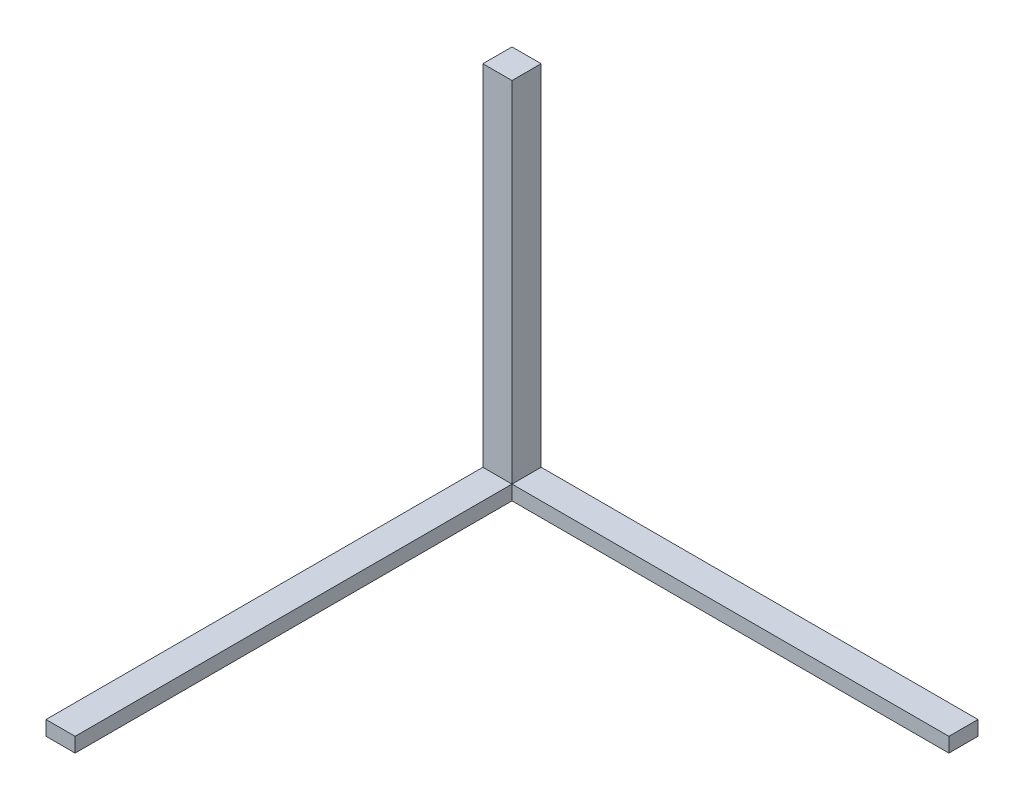
ISO-10303-21;
HEADER;
FILE_DESCRIPTION(('STEP AP214'),'2;1');
FILE_NAME('part.step','',(''),(''),'','','');
FILE_SCHEMA(('AUTOMOTIVE_DESIGN { 1 0 10303 214 1 1 1 1 }'));
ENDSEC;
DATA;
#1=APPLICATION_CONTEXT('core data for automotive mechanical design processes');
#2=APPLICATION_PROTOCOL_DEFINITION('international standard','automotive_design',2000,#1);
#3=PRODUCT_CONTEXT('',#1,'mechanical');
#4=PRODUCT('Part','Part','',(#3));
#5=PRODUCT_RELATED_PRODUCT_CATEGORY('part','',(#4));
#6=PRODUCT_DEFINITION_FORMATION('','',#4);
#7=PRODUCT_DEFINITION_CONTEXT('part definition',#1,'design');
#8=PRODUCT_DEFINITION('design','',#6,#7);
#9=PRODUCT_DEFINITION_SHAPE('','',#8);
#10=(LENGTH_UNIT() NAMED_UNIT(*) SI_UNIT(.MILLI.,.METRE.));
#11=(NAMED_UNIT(*) PLANE_ANGLE_UNIT() SI_UNIT($,.RADIAN.));
#12=(NAMED_UNIT(*) SI_UNIT($,.STERADIAN.) SOLID_ANGLE_UNIT());
#13=UNCERTAINTY_MEASURE_WITH_UNIT(LENGTH_MEASURE(1.E-05),#10,'distance_accuracy_value','');
#14=(GEOMETRIC_REPRESENTATION_CONTEXT(3) GLOBAL_UNCERTAINTY_ASSIGNED_CONTEXT((#13)) GLOBAL_UNIT_ASSIGNED_CONTEXT((#10,
#11,#12)) REPRESENTATION_CONTEXT('',''));
#15=CARTESIAN_POINT('',(0.,0.,0.));
#16=DIRECTION('',(0.,0.,1.));
#17=DIRECTION('',(1.,0.,0.));
#18=AXIS2_PLACEMENT_3D('',#15,#16,#17);
#19=CARTESIAN_POINT('',(10.,250.,10.));
#20=DIRECTION('',(-1.,0.,0.));
#21=DIRECTION('',(0.,0.,1.));
#22=AXIS2_PLACEMENT_3D('',#19,#20,#21);
#23=PLANE('',#22);
#24=DIRECTION('',(0.,-1.,0.));
#25=VECTOR('',#24,1.);
#26=CARTESIAN_POINT('',(10.,10.,10.));
#27=LINE('',#26,#25);
#28=CARTESIAN_POINT('',(10.,10.,10.));
#29=VERTEX_POINT('',#28);
#30=CARTESIAN_POINT('',(10.,0.,10.));
#31=VERTEX_POINT('',#30);
#32=EDGE_CURVE('E190',#29,#31,#27,.T.);
#33=ORIENTED_EDGE('',*,*,#32,.F.);
#34=DIRECTION('',(0.,0.,1.));
#35=VECTOR('',#34,1.);
#36=CARTESIAN_POINT('',(10.,10.,0.));
#37=LINE('',#36,#35);
#38=CARTESIAN_POINT('',(10.,10.,310.));
#39=VERTEX_POINT('',#38);
#40=EDGE_CURVE('E161',#29,#39,#37,.T.);
#41=ORIENTED_EDGE('',*,*,#40,.T.);
#42=DIRECTION('',(0.,-1.,0.));
#43=VECTOR('',#42,1.);
#44=CARTESIAN_POINT('',(10.,10.,310.));
#45=LINE('',#44,#43);
#46=CARTESIAN_POINT('',(10.,0.,310.));
#47=VERTEX_POINT('',#46);
#48=EDGE_CURVE('E153',#39,#47,#45,.T.);
#49=ORIENTED_EDGE('',*,*,#48,.T.);
#50=DIRECTION('',(0.,0.,-1.));
#51=VECTOR('',#50,1.);
#52=CARTESIAN_POINT('',(10.,0.,10.));
#53=LINE('',#52,#51);
#54=EDGE_CURVE('E133',#47,#31,#53,.T.);
#55=ORIENTED_EDGE('',*,*,#54,.T.);
#56=EDGE_LOOP('',(#33,#41,#49,#55));
#57=FACE_BOUND('',#56,.T.);
#58=ADVANCED_FACE('F39',(#57),#23,.F.);
#59=CARTESIAN_POINT('',(-10.,250.,10.));
#60=DIRECTION('',(1.,0.,0.));
#61=DIRECTION('',(0.,0.,-1.));
#62=AXIS2_PLACEMENT_3D('',#59,#60,#61);
#63=PLANE('',#62);
#64=DIRECTION('',(0.,0.,1.));
#65=VECTOR('',#64,1.);
#66=CARTESIAN_POINT('',(-10.,0.,10.));
#67=LINE('',#66,#65);
#68=CARTESIAN_POINT('',(-10.,0.,-10.));
#69=VERTEX_POINT('',#68);
#70=CARTESIAN_POINT('',(-9.99999999999996,0.,310.));
#71=VERTEX_POINT('',#70);
#72=EDGE_CURVE('E130',#69,#71,#67,.T.);
#73=ORIENTED_EDGE('',*,*,#72,.T.);
#74=DIRECTION('',(0.,-1.,0.));
#75=VECTOR('',#74,1.);
#76=CARTESIAN_POINT('',(-9.99999999999996,10.,310.));
#77=LINE('',#76,#75);
#78=CARTESIAN_POINT('',(-9.99999999999996,10.,310.));
#79=VERTEX_POINT('',#78);
#80=EDGE_CURVE('E134',#79,#71,#77,.T.);
#81=ORIENTED_EDGE('',*,*,#80,.F.);
#82=DIRECTION('',(0.,0.,1.));
#83=VECTOR('',#82,1.);
#84=CARTESIAN_POINT('',(-10.,10.,0.));
#85=LINE('',#84,#83);
#86=CARTESIAN_POINT('',(-10.,10.,10.));
#87=VERTEX_POINT('',#86);
#88=EDGE_CURVE('E165',#87,#79,#85,.T.);
#89=ORIENTED_EDGE('',*,*,#88,.F.);
#90=DIRECTION('',(0.,-1.,0.));
#91=VECTOR('',#90,1.);
#92=CARTESIAN_POINT('',(-10.,250.,10.));
#93=LINE('',#92,#91);
#94=CARTESIAN_POINT('',(-10.,250.,10.));
#95=VERTEX_POINT('',#94);
#96=EDGE_CURVE('E11',#95,#87,#93,.T.);
#97=ORIENTED_EDGE('',*,*,#96,.F.);
#98=DIRECTION('',(0.,0.,1.));
#99=VECTOR('',#98,1.);
#100=CARTESIAN_POINT('',(-10.,250.,10.));
#101=LINE('',#100,#99);
#102=CARTESIAN_POINT('',(-10.,250.,-10.));
#103=VERTEX_POINT('',#102);
#104=EDGE_CURVE('E107',#103,#95,#101,.T.);
#105=ORIENTED_EDGE('',*,*,#104,.F.);
#106=DIRECTION('',(0.,-1.,0.));
#107=VECTOR('',#106,1.);
#108=CARTESIAN_POINT('',(-10.,250.,-10.));
#109=LINE('',#108,#107);
#110=EDGE_CURVE('E126',#103,#69,#109,.T.);
#111=ORIENTED_EDGE('',*,*,#110,.T.);
#112=EDGE_LOOP('',(#73,#81,#89,#97,#105,#111));
#113=FACE_BOUND('',#112,.T.);
#114=ADVANCED_FACE('F41',(#113),#63,.F.);
#115=CARTESIAN_POINT('',(10.,250.,10.));
#116=DIRECTION('',(0.,0.,-1.));
#117=DIRECTION('',(-1.,0.,0.));
#118=AXIS2_PLACEMENT_3D('',#115,#116,#117);
#119=PLANE('',#118);
#120=ORIENTED_EDGE('',*,*,#96,.T.);
#121=DIRECTION('',(1.,0.,0.));
#122=VECTOR('',#121,1.);
#123=CARTESIAN_POINT('',(0.,10.,10.));
#124=LINE('',#123,#122);
#125=EDGE_CURVE('E117',#87,#29,#124,.T.);
#126=ORIENTED_EDGE('',*,*,#125,.T.);
#127=DIRECTION('',(0.,-1.,0.));
#128=VECTOR('',#127,1.);
#129=CARTESIAN_POINT('',(10.,250.,10.));
#130=LINE('',#129,#128);
#131=CARTESIAN_POINT('',(10.,250.,10.));
#132=VERTEX_POINT('',#131);
#133=EDGE_CURVE('E48',#132,#29,#130,.T.);
#134=ORIENTED_EDGE('',*,*,#133,.F.);
#135=DIRECTION('',(1.,0.,0.));
#136=VECTOR('',#135,1.);
#137=CARTESIAN_POINT('',(10.,250.,10.));
#138=LINE('',#137,#136);
#139=EDGE_CURVE('E100',#95,#132,#138,.T.);
#140=ORIENTED_EDGE('',*,*,#139,.F.);
#141=EDGE_LOOP('',(#120,#126,#134,#140));
#142=FACE_BOUND('',#141,.T.);
#143=ADVANCED_FACE('F114',(#142),#119,.F.);
#144=ORIENTED_EDGE('',*,*,#133,.T.);
#145=DIRECTION('',(0.,0.,-1.));
#146=VECTOR('',#145,1.);
#147=CARTESIAN_POINT('',(10.,10.,0.));
#148=LINE('',#147,#146);
#149=CARTESIAN_POINT('',(10.,10.,-10.));
#150=VERTEX_POINT('',#149);
#151=EDGE_CURVE('E177',#29,#150,#148,.T.);
#152=ORIENTED_EDGE('',*,*,#151,.T.);
#153=DIRECTION('',(0.,-1.,0.));
#154=VECTOR('',#153,1.);
#155=CARTESIAN_POINT('',(10.,250.,-10.));
#156=LINE('',#155,#154);
#157=CARTESIAN_POINT('',(10.,250.,-10.));
#158=VERTEX_POINT('',#157);
#159=EDGE_CURVE('E120',#158,#150,#156,.T.);
#160=ORIENTED_EDGE('',*,*,#159,.F.);
#161=DIRECTION('',(0.,0.,-1.));
#162=VECTOR('',#161,1.);
#163=CARTESIAN_POINT('',(10.,250.,10.));
#164=LINE('',#163,#162);
#165=EDGE_CURVE('E104',#132,#158,#164,.T.);
#166=ORIENTED_EDGE('',*,*,#165,.F.);
#167=EDGE_LOOP('',(#144,#152,#160,#166));
#168=FACE_BOUND('',#167,.T.);
#169=ADVANCED_FACE('F121',(#168),#23,.F.);
#170=CARTESIAN_POINT('',(10.,250.,-10.));
#171=DIRECTION('',(0.,0.,1.));
#172=DIRECTION('',(1.,0.,0.));
#173=AXIS2_PLACEMENT_3D('',#170,#171,#172);
#174=PLANE('',#173);
#175=DIRECTION('',(-1.,0.,0.));
#176=VECTOR('',#175,1.);
#177=CARTESIAN_POINT('',(10.,0.,-10.));
#178=LINE('',#177,#176);
#179=CARTESIAN_POINT('',(310.,0.,-10.0000000000011));
#180=VERTEX_POINT('',#179);
#181=EDGE_CURVE('E76',#180,#69,#178,.T.);
#182=ORIENTED_EDGE('',*,*,#181,.T.);
#183=ORIENTED_EDGE('',*,*,#110,.F.);
#184=DIRECTION('',(-1.,0.,0.));
#185=VECTOR('',#184,1.);
#186=CARTESIAN_POINT('',(10.,250.,-10.));
#187=LINE('',#186,#185);
#188=EDGE_CURVE('E64',#158,#103,#187,.T.);
#189=ORIENTED_EDGE('',*,*,#188,.F.);
#190=ORIENTED_EDGE('',*,*,#159,.T.);
#191=DIRECTION('',(1.,0.,0.));
#192=VECTOR('',#191,1.);
#193=CARTESIAN_POINT('',(0.,10.,-10.));
#194=LINE('',#193,#192);
#195=CARTESIAN_POINT('',(310.,10.,-10.0000000000011));
#196=VERTEX_POINT('',#195);
#197=EDGE_CURVE('E55',#150,#196,#194,.T.);
#198=ORIENTED_EDGE('',*,*,#197,.T.);
#199=DIRECTION('',(0.,-1.,0.));
#200=VECTOR('',#199,1.);
#201=CARTESIAN_POINT('',(310.,10.,-10.0000000000011));
#202=LINE('',#201,#200);
#203=EDGE_CURVE('E182',#196,#180,#202,.T.);
#204=ORIENTED_EDGE('',*,*,#203,.T.);
#205=EDGE_LOOP('',(#182,#183,#189,#190,#198,#204));
#206=FACE_BOUND('',#205,.T.);
#207=ADVANCED_FACE('F143',(#206),#174,.F.);
#208=CARTESIAN_POINT('',(0.,250.,0.));
#209=DIRECTION('',(0.,1.,0.));
#210=DIRECTION('',(0.,0.,1.));
#211=AXIS2_PLACEMENT_3D('',#208,#209,#210);
#212=PLANE('',#211);
#213=ORIENTED_EDGE('',*,*,#104,.T.);
#214=ORIENTED_EDGE('',*,*,#139,.T.);
#215=ORIENTED_EDGE('',*,*,#165,.T.);
#216=ORIENTED_EDGE('',*,*,#188,.T.);
#217=EDGE_LOOP('',(#213,#214,#215,#216));
#218=FACE_BOUND('',#217,.T.);
#219=ADVANCED_FACE('F102',(#218),#212,.T.);
#220=CARTESIAN_POINT('',(0.,0.,0.));
#221=DIRECTION('',(0.,1.,0.));
#222=DIRECTION('',(0.,0.,1.));
#223=AXIS2_PLACEMENT_3D('',#220,#221,#222);
#224=PLANE('',#223);
#225=ORIENTED_EDGE('',*,*,#72,.F.);
#226=ORIENTED_EDGE('',*,*,#181,.F.);
#227=DIRECTION('',(0.,0.,-1.));
#228=VECTOR('',#227,1.);
#229=CARTESIAN_POINT('',(310.,0.,-1.72084568816899E-12));
#230=LINE('',#229,#228);
#231=CARTESIAN_POINT('',(310.,0.,9.99999999999888));
#232=VERTEX_POINT('',#231);
#233=EDGE_CURVE('E191',#232,#180,#230,.T.);
#234=ORIENTED_EDGE('',*,*,#233,.F.);
#235=DIRECTION('',(1.,0.,0.));
#236=VECTOR('',#235,1.);
#237=CARTESIAN_POINT('',(0.,0.,10.));
#238=LINE('',#237,#236);
#239=EDGE_CURVE('E186',#31,#232,#238,.T.);
#240=ORIENTED_EDGE('',*,*,#239,.F.);
#241=ORIENTED_EDGE('',*,*,#54,.F.);
#242=DIRECTION('',(1.,0.,0.));
#243=VECTOR('',#242,1.);
#244=CARTESIAN_POINT('',(0.,0.,310.));
#245=LINE('',#244,#243);
#246=EDGE_CURVE('E157',#71,#47,#245,.T.);
#247=ORIENTED_EDGE('',*,*,#246,.F.);
#248=EDGE_LOOP('',(#225,#226,#234,#240,#241,#247));
#249=FACE_BOUND('',#248,.T.);
#250=ADVANCED_FACE('F218',(#249),#224,.F.);
#251=CARTESIAN_POINT('',(0.,10.,310.));
#252=DIRECTION('',(0.,0.,-1.));
#253=DIRECTION('',(-1.,0.,0.));
#254=AXIS2_PLACEMENT_3D('',#251,#252,#253);
#255=PLANE('',#254);
#256=ORIENTED_EDGE('',*,*,#246,.T.);
#257=ORIENTED_EDGE('',*,*,#48,.F.);
#258=DIRECTION('',(1.,0.,0.));
#259=VECTOR('',#258,1.);
#260=CARTESIAN_POINT('',(0.,10.,310.));
#261=LINE('',#260,#259);
#262=EDGE_CURVE('E87',#79,#39,#261,.T.);
#263=ORIENTED_EDGE('',*,*,#262,.F.);
#264=ORIENTED_EDGE('',*,*,#80,.T.);
#265=EDGE_LOOP('',(#256,#257,#263,#264));
#266=FACE_BOUND('',#265,.T.);
#267=ADVANCED_FACE('F223',(#266),#255,.F.);
#268=CARTESIAN_POINT('',(0.,10.,0.));
#269=DIRECTION('',(0.,1.,0.));
#270=DIRECTION('',(0.,0.,1.));
#271=AXIS2_PLACEMENT_3D('',#268,#269,#270);
#272=PLANE('',#271);
#273=ORIENTED_EDGE('',*,*,#40,.F.);
#274=ORIENTED_EDGE('',*,*,#125,.F.);
#275=ORIENTED_EDGE('',*,*,#88,.T.);
#276=ORIENTED_EDGE('',*,*,#262,.T.);
#277=EDGE_LOOP('',(#273,#274,#275,#276));
#278=FACE_BOUND('',#277,.T.);
#279=ADVANCED_FACE('F225',(#278),#272,.T.);
#280=CARTESIAN_POINT('',(0.,10.,10.));
#281=DIRECTION('',(0.,0.,-1.));
#282=DIRECTION('',(-1.,0.,0.));
#283=AXIS2_PLACEMENT_3D('',#280,#281,#282);
#284=PLANE('',#283);
#285=ORIENTED_EDGE('',*,*,#239,.T.);
#286=DIRECTION('',(0.,-1.,0.));
#287=VECTOR('',#286,1.);
#288=CARTESIAN_POINT('',(310.,10.,9.99999999999888));
#289=LINE('',#288,#287);
#290=CARTESIAN_POINT('',(310.,10.,9.99999999999888));
#291=VERTEX_POINT('',#290);
#292=EDGE_CURVE('E183',#291,#232,#289,.T.);
#293=ORIENTED_EDGE('',*,*,#292,.F.);
#294=DIRECTION('',(1.,0.,0.));
#295=VECTOR('',#294,1.);
#296=CARTESIAN_POINT('',(0.,10.,10.));
#297=LINE('',#296,#295);
#298=EDGE_CURVE('E173',#29,#291,#297,.T.);
#299=ORIENTED_EDGE('',*,*,#298,.F.);
#300=ORIENTED_EDGE('',*,*,#32,.T.);
#301=EDGE_LOOP('',(#285,#293,#299,#300));
#302=FACE_BOUND('',#301,.T.);
#303=ADVANCED_FACE('F214',(#302),#284,.F.);
#304=CARTESIAN_POINT('',(310.,10.,-1.72084568816899E-12));
#305=DIRECTION('',(-1.,0.,0.));
#306=DIRECTION('',(0.,0.,1.));
#307=AXIS2_PLACEMENT_3D('',#304,#305,#306);
#308=PLANE('',#307);
#309=ORIENTED_EDGE('',*,*,#233,.T.);
#310=ORIENTED_EDGE('',*,*,#203,.F.);
#311=DIRECTION('',(0.,0.,-1.));
#312=VECTOR('',#311,1.);
#313=CARTESIAN_POINT('',(310.,10.,-1.72084568816899E-12));
#314=LINE('',#313,#312);
#315=EDGE_CURVE('E162',#291,#196,#314,.T.);
#316=ORIENTED_EDGE('',*,*,#315,.F.);
#317=ORIENTED_EDGE('',*,*,#292,.T.);
#318=EDGE_LOOP('',(#309,#310,#316,#317));
#319=FACE_BOUND('',#318,.T.);
#320=ADVANCED_FACE('F205',(#319),#308,.F.);
#321=CARTESIAN_POINT('',(0.,10.,0.));
#322=DIRECTION('',(0.,1.,0.));
#323=DIRECTION('',(0.,0.,1.));
#324=AXIS2_PLACEMENT_3D('',#321,#322,#323);
#325=PLANE('',#324);
#326=ORIENTED_EDGE('',*,*,#298,.T.);
#327=ORIENTED_EDGE('',*,*,#315,.T.);
#328=ORIENTED_EDGE('',*,*,#197,.F.);
#329=ORIENTED_EDGE('',*,*,#151,.F.);
#330=EDGE_LOOP('',(#326,#327,#328,#329));
#331=FACE_BOUND('',#330,.T.);
#332=ADVANCED_FACE('F230',(#331),#325,.T.);
#333=CLOSED_SHELL('',(#58,#114,#143,#169,#207,#219,#250,#267,#279,#303,#320,#332));
#334=MANIFOLD_SOLID_BREP('B2',#333);
#335=ADVANCED_BREP_SHAPE_REPRESENTATION('',(#18,#334),#14);
#336=SHAPE_DEFINITION_REPRESENTATION(#9,#335);
ENDSEC;
END-ISO-10303-21;
